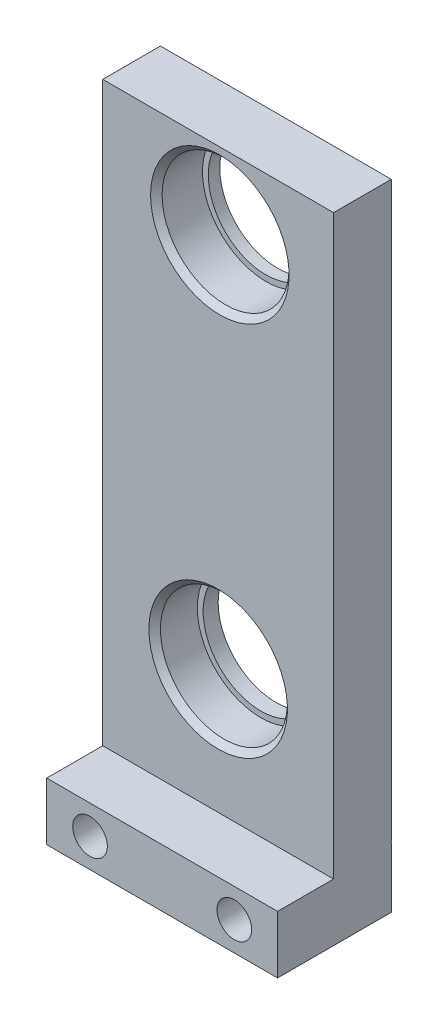
ISO-10303-21;
HEADER;
FILE_DESCRIPTION(('STEP AP214'),'2;1');
FILE_NAME('part.step','',(''),(''),'','','');
FILE_SCHEMA(('AUTOMOTIVE_DESIGN { 1 0 10303 214 1 1 1 1 }'));
ENDSEC;
DATA;
#1=APPLICATION_CONTEXT('core data for automotive mechanical design processes');
#2=APPLICATION_PROTOCOL_DEFINITION('international standard','automotive_design',2000,#1);
#3=PRODUCT_CONTEXT('',#1,'mechanical');
#4=PRODUCT('Part','Part','',(#3));
#5=PRODUCT_RELATED_PRODUCT_CATEGORY('part','',(#4));
#6=PRODUCT_DEFINITION_FORMATION('','',#4);
#7=PRODUCT_DEFINITION_CONTEXT('part definition',#1,'design');
#8=PRODUCT_DEFINITION('design','',#6,#7);
#9=PRODUCT_DEFINITION_SHAPE('','',#8);
#10=(LENGTH_UNIT() NAMED_UNIT(*) SI_UNIT(.MILLI.,.METRE.));
#11=(NAMED_UNIT(*) PLANE_ANGLE_UNIT() SI_UNIT($,.RADIAN.));
#12=(NAMED_UNIT(*) SI_UNIT($,.STERADIAN.) SOLID_ANGLE_UNIT());
#13=UNCERTAINTY_MEASURE_WITH_UNIT(LENGTH_MEASURE(1.E-05),#10,'distance_accuracy_value','');
#14=(GEOMETRIC_REPRESENTATION_CONTEXT(3) GLOBAL_UNCERTAINTY_ASSIGNED_CONTEXT((#13)) GLOBAL_UNIT_ASSIGNED_CONTEXT((#10,
#11,#12)) REPRESENTATION_CONTEXT('',''));
#15=CARTESIAN_POINT('',(0.,0.,0.));
#16=DIRECTION('',(0.,0.,1.));
#17=DIRECTION('',(1.,0.,0.));
#18=AXIS2_PLACEMENT_3D('',#15,#16,#17);
#19=CARTESIAN_POINT('',(7.5,5.,21.));
#20=DIRECTION('',(0.,0.,-1.));
#21=DIRECTION('',(-1.,0.,0.));
#22=AXIS2_PLACEMENT_3D('',#19,#20,#21);
#23=CYLINDRICAL_SURFACE('',#22,3.);
#24=CARTESIAN_POINT('',(7.5,5.,19.7));
#25=DIRECTION('',(0.,0.,-1.));
#26=DIRECTION('',(-1.,0.,0.));
#27=AXIS2_PLACEMENT_3D('',#24,#25,#26);
#28=CIRCLE('',#27,3.);
#29=CARTESIAN_POINT('',(4.5,5.,19.7));
#30=VERTEX_POINT('',#29);
#31=EDGE_CURVE('E271',#30,#30,#28,.T.);
#32=ORIENTED_EDGE('',*,*,#31,.F.);
#33=EDGE_LOOP('',(#32));
#34=FACE_BOUND('',#33,.T.);
#35=CARTESIAN_POINT('',(7.5,5.,13.));
#36=DIRECTION('',(0.,0.,-1.));
#37=DIRECTION('',(-1.,0.,0.));
#38=AXIS2_PLACEMENT_3D('',#35,#36,#37);
#39=CIRCLE('',#38,3.);
#40=CARTESIAN_POINT('',(4.5,5.,13.));
#41=VERTEX_POINT('',#40);
#42=EDGE_CURVE('E275',#41,#41,#39,.F.);
#43=ORIENTED_EDGE('',*,*,#42,.F.);
#44=EDGE_LOOP('',(#43));
#45=FACE_BOUND('',#44,.T.);
#46=ADVANCED_FACE('F53',(#34,#45),#23,.F.);
#47=CARTESIAN_POINT('',(32.5,5.,21.));
#48=DIRECTION('',(0.,0.,-1.));
#49=DIRECTION('',(-1.,0.,0.));
#50=AXIS2_PLACEMENT_3D('',#47,#48,#49);
#51=CYLINDRICAL_SURFACE('',#50,3.);
#52=CARTESIAN_POINT('',(32.5,5.,19.7));
#53=DIRECTION('',(0.,0.,-1.));
#54=DIRECTION('',(-1.,0.,0.));
#55=AXIS2_PLACEMENT_3D('',#52,#53,#54);
#56=CIRCLE('',#55,3.);
#57=CARTESIAN_POINT('',(29.5,5.,19.7));
#58=VERTEX_POINT('',#57);
#59=EDGE_CURVE('E166',#58,#58,#56,.T.);
#60=ORIENTED_EDGE('',*,*,#59,.F.);
#61=EDGE_LOOP('',(#60));
#62=FACE_BOUND('',#61,.T.);
#63=CARTESIAN_POINT('',(32.5,5.,13.));
#64=DIRECTION('',(0.,0.,-1.));
#65=DIRECTION('',(-1.,0.,0.));
#66=AXIS2_PLACEMENT_3D('',#63,#64,#65);
#67=CIRCLE('',#66,3.);
#68=CARTESIAN_POINT('',(29.5,5.,13.));
#69=VERTEX_POINT('',#68);
#70=EDGE_CURVE('E279',#69,#69,#67,.F.);
#71=ORIENTED_EDGE('',*,*,#70,.F.);
#72=EDGE_LOOP('',(#71));
#73=FACE_BOUND('',#72,.T.);
#74=ADVANCED_FACE('F361',(#62,#73),#51,.F.);
#75=CARTESIAN_POINT('',(0.,0.,10.));
#76=DIRECTION('',(0.,0.,-1.));
#77=DIRECTION('',(-1.,0.,0.));
#78=AXIS2_PLACEMENT_3D('',#75,#76,#77);
#79=PLANE('',#78);
#80=CARTESIAN_POINT('',(20.2904559974548,96.8,10.));
#81=DIRECTION('',(0.,0.,-1.));
#82=DIRECTION('',(-1.,0.,0.));
#83=AXIS2_PLACEMENT_3D('',#80,#81,#82);
#84=CIRCLE('',#83,12.);
#85=CARTESIAN_POINT('',(8.29045599745482,96.8,10.));
#86=VERTEX_POINT('',#85);
#87=EDGE_CURVE('E147',#86,#86,#84,.T.);
#88=ORIENTED_EDGE('',*,*,#87,.T.);
#89=EDGE_LOOP('',(#88));
#90=FACE_BOUND('',#89,.T.);
#91=CARTESIAN_POINT('',(20.,31.5,10.));
#92=DIRECTION('',(0.,0.,-1.));
#93=DIRECTION('',(-1.,0.,0.));
#94=AXIS2_PLACEMENT_3D('',#91,#92,#93);
#95=CIRCLE('',#94,12.);
#96=CARTESIAN_POINT('',(8.00000000000004,31.5,10.));
#97=VERTEX_POINT('',#96);
#98=EDGE_CURVE('E264',#97,#97,#95,.T.);
#99=ORIENTED_EDGE('',*,*,#98,.T.);
#100=EDGE_LOOP('',(#99));
#101=FACE_BOUND('',#100,.T.);
#102=DIRECTION('',(-1.,0.,0.));
#103=VECTOR('',#102,1.);
#104=CARTESIAN_POINT('',(0.,10.,10.));
#105=LINE('',#104,#103);
#106=CARTESIAN_POINT('',(40.,10.,10.));
#107=VERTEX_POINT('',#106);
#108=CARTESIAN_POINT('',(0.,10.,10.));
#109=VERTEX_POINT('',#108);
#110=EDGE_CURVE('E72',#107,#109,#105,.T.);
#111=ORIENTED_EDGE('',*,*,#110,.F.);
#112=DIRECTION('',(0.,1.,0.));
#113=VECTOR('',#112,1.);
#114=CARTESIAN_POINT('',(40.,0.,10.));
#115=LINE('',#114,#113);
#116=CARTESIAN_POINT('',(40.,110.,10.));
#117=VERTEX_POINT('',#116);
#118=EDGE_CURVE('E228',#107,#117,#115,.T.);
#119=ORIENTED_EDGE('',*,*,#118,.T.);
#120=DIRECTION('',(-1.,0.,0.));
#121=VECTOR('',#120,1.);
#122=CARTESIAN_POINT('',(0.,110.,10.));
#123=LINE('',#122,#121);
#124=CARTESIAN_POINT('',(0.,110.,10.));
#125=VERTEX_POINT('',#124);
#126=EDGE_CURVE('E232',#117,#125,#123,.T.);
#127=ORIENTED_EDGE('',*,*,#126,.T.);
#128=DIRECTION('',(0.,-1.,0.));
#129=VECTOR('',#128,1.);
#130=CARTESIAN_POINT('',(0.,0.,10.));
#131=LINE('',#130,#129);
#132=EDGE_CURVE('E225',#125,#109,#131,.T.);
#133=ORIENTED_EDGE('',*,*,#132,.T.);
#134=EDGE_LOOP('',(#111,#119,#127,#133));
#135=FACE_BOUND('',#134,.T.);
#136=ADVANCED_FACE('F334',(#90,#101,#135),#79,.F.);
#137=CARTESIAN_POINT('',(0.,0.,0.));
#138=DIRECTION('',(0.,0.,-1.));
#139=DIRECTION('',(-1.,0.,0.));
#140=AXIS2_PLACEMENT_3D('',#137,#138,#139);
#141=PLANE('',#140);
#142=CARTESIAN_POINT('',(20.,31.5,0.));
#143=DIRECTION('',(0.,0.,-1.));
#144=DIRECTION('',(-1.,0.,0.));
#145=AXIS2_PLACEMENT_3D('',#142,#143,#144);
#146=CIRCLE('',#145,10.);
#147=CARTESIAN_POINT('',(10.,31.5,0.));
#148=VERTEX_POINT('',#147);
#149=EDGE_CURVE('E289',#148,#148,#146,.F.);
#150=ORIENTED_EDGE('',*,*,#149,.T.);
#151=EDGE_LOOP('',(#150));
#152=FACE_BOUND('',#151,.T.);
#153=CARTESIAN_POINT('',(20.2904559974548,96.8,0.));
#154=DIRECTION('',(0.,0.,-1.));
#155=DIRECTION('',(-1.,0.,0.));
#156=AXIS2_PLACEMENT_3D('',#153,#154,#155);
#157=CIRCLE('',#156,10.);
#158=CARTESIAN_POINT('',(10.2904559974548,96.8,0.));
#159=VERTEX_POINT('',#158);
#160=EDGE_CURVE('E187',#159,#159,#157,.T.);
#161=ORIENTED_EDGE('',*,*,#160,.F.);
#162=EDGE_LOOP('',(#161));
#163=FACE_BOUND('',#162,.T.);
#164=DIRECTION('',(1.,0.,0.));
#165=VECTOR('',#164,1.);
#166=CARTESIAN_POINT('',(40.,10.6,0.));
#167=LINE('',#166,#165);
#168=CARTESIAN_POINT('',(0.,10.6,0.));
#169=VERTEX_POINT('',#168);
#170=CARTESIAN_POINT('',(40.,10.6,0.));
#171=VERTEX_POINT('',#170);
#172=EDGE_CURVE('E198',#169,#171,#167,.T.);
#173=ORIENTED_EDGE('',*,*,#172,.F.);
#174=DIRECTION('',(0.,-1.,0.));
#175=VECTOR('',#174,1.);
#176=CARTESIAN_POINT('',(0.,0.,0.));
#177=LINE('',#176,#175);
#178=CARTESIAN_POINT('',(0.,110.,0.));
#179=VERTEX_POINT('',#178);
#180=EDGE_CURVE('E236',#179,#169,#177,.T.);
#181=ORIENTED_EDGE('',*,*,#180,.F.);
#182=DIRECTION('',(-1.,0.,0.));
#183=VECTOR('',#182,1.);
#184=CARTESIAN_POINT('',(0.,110.,0.));
#185=LINE('',#184,#183);
#186=CARTESIAN_POINT('',(40.,110.,0.));
#187=VERTEX_POINT('',#186);
#188=EDGE_CURVE('E229',#187,#179,#185,.T.);
#189=ORIENTED_EDGE('',*,*,#188,.F.);
#190=DIRECTION('',(0.,1.,0.));
#191=VECTOR('',#190,1.);
#192=CARTESIAN_POINT('',(40.,0.,0.));
#193=LINE('',#192,#191);
#194=EDGE_CURVE('E242',#171,#187,#193,.T.);
#195=ORIENTED_EDGE('',*,*,#194,.F.);
#196=EDGE_LOOP('',(#173,#181,#189,#195));
#197=FACE_BOUND('',#196,.T.);
#198=ADVANCED_FACE('F322',(#152,#163,#197),#141,.T.);
#199=CARTESIAN_POINT('',(0.,0.,10.));
#200=DIRECTION('',(1.,0.,0.));
#201=DIRECTION('',(0.,0.,-1.));
#202=AXIS2_PLACEMENT_3D('',#199,#200,#201);
#203=PLANE('',#202);
#204=ORIENTED_EDGE('',*,*,#180,.T.);
#205=DIRECTION('',(0.,0.,-1.));
#206=VECTOR('',#205,1.);
#207=CARTESIAN_POINT('',(0.,10.6,0.1));
#208=LINE('',#207,#206);
#209=CARTESIAN_POINT('',(0.,10.6,0.1));
#210=VERTEX_POINT('',#209);
#211=EDGE_CURVE('E217',#210,#169,#208,.T.);
#212=ORIENTED_EDGE('',*,*,#211,.F.);
#213=DIRECTION('',(0.,1.,0.));
#214=VECTOR('',#213,1.);
#215=CARTESIAN_POINT('',(0.,10.5,0.1));
#216=LINE('',#215,#214);
#217=CARTESIAN_POINT('',(0.,10.5,0.1));
#218=VERTEX_POINT('',#217);
#219=EDGE_CURVE('E202',#218,#210,#216,.T.);
#220=ORIENTED_EDGE('',*,*,#219,.F.);
#221=DIRECTION('',(0.,0.,-1.));
#222=VECTOR('',#221,1.);
#223=CARTESIAN_POINT('',(0.,10.5,0.1));
#224=LINE('',#223,#222);
#225=CARTESIAN_POINT('',(0.,10.5,0.));
#226=VERTEX_POINT('',#225);
#227=EDGE_CURVE('E220',#218,#226,#224,.T.);
#228=ORIENTED_EDGE('',*,*,#227,.T.);
#229=CARTESIAN_POINT('',(0.,0.,0.));
#230=VERTEX_POINT('',#229);
#231=EDGE_CURVE('E143',#226,#230,#177,.T.);
#232=ORIENTED_EDGE('',*,*,#231,.T.);
#233=DIRECTION('',(0.,0.,-1.));
#234=VECTOR('',#233,1.);
#235=CARTESIAN_POINT('',(0.,0.,10.));
#236=LINE('',#235,#234);
#237=CARTESIAN_POINT('',(0.,0.,19.7));
#238=VERTEX_POINT('',#237);
#239=EDGE_CURVE('E134',#238,#230,#236,.T.);
#240=ORIENTED_EDGE('',*,*,#239,.F.);
#241=DIRECTION('',(0.,-1.,0.));
#242=VECTOR('',#241,1.);
#243=CARTESIAN_POINT('',(0.,0.,19.7));
#244=LINE('',#243,#242);
#245=CARTESIAN_POINT('',(0.,10.,19.7));
#246=VERTEX_POINT('',#245);
#247=EDGE_CURVE('E140',#246,#238,#244,.T.);
#248=ORIENTED_EDGE('',*,*,#247,.F.);
#249=DIRECTION('',(0.,0.,-1.));
#250=VECTOR('',#249,1.);
#251=CARTESIAN_POINT('',(0.,10.,19.7));
#252=LINE('',#251,#250);
#253=EDGE_CURVE('E175',#246,#109,#252,.T.);
#254=ORIENTED_EDGE('',*,*,#253,.T.);
#255=ORIENTED_EDGE('',*,*,#132,.F.);
#256=DIRECTION('',(0.,0.,-1.));
#257=VECTOR('',#256,1.);
#258=CARTESIAN_POINT('',(0.,110.,10.));
#259=LINE('',#258,#257);
#260=EDGE_CURVE('E235',#125,#179,#259,.T.);
#261=ORIENTED_EDGE('',*,*,#260,.T.);
#262=EDGE_LOOP('',(#204,#212,#220,#228,#232,#240,#248,#254,#255,#261));
#263=FACE_BOUND('',#262,.T.);
#264=ADVANCED_FACE('F137',(#263),#203,.F.);
#265=CARTESIAN_POINT('',(0.,0.,10.));
#266=DIRECTION('',(0.,1.,0.));
#267=DIRECTION('',(0.,0.,1.));
#268=AXIS2_PLACEMENT_3D('',#265,#266,#267);
#269=PLANE('',#268);
#270=DIRECTION('',(1.,0.,0.));
#271=VECTOR('',#270,1.);
#272=CARTESIAN_POINT('',(0.,0.,0.));
#273=LINE('',#272,#271);
#274=CARTESIAN_POINT('',(40.,0.,0.));
#275=VERTEX_POINT('',#274);
#276=EDGE_CURVE('E239',#230,#275,#273,.T.);
#277=ORIENTED_EDGE('',*,*,#276,.T.);
#278=DIRECTION('',(0.,0.,-1.));
#279=VECTOR('',#278,1.);
#280=CARTESIAN_POINT('',(40.,0.,10.));
#281=LINE('',#280,#279);
#282=CARTESIAN_POINT('',(40.,0.,19.7));
#283=VERTEX_POINT('',#282);
#284=EDGE_CURVE('E148',#283,#275,#281,.T.);
#285=ORIENTED_EDGE('',*,*,#284,.F.);
#286=DIRECTION('',(1.,0.,0.));
#287=VECTOR('',#286,1.);
#288=CARTESIAN_POINT('',(0.,0.,19.7));
#289=LINE('',#288,#287);
#290=EDGE_CURVE('E151',#238,#283,#289,.T.);
#291=ORIENTED_EDGE('',*,*,#290,.F.);
#292=ORIENTED_EDGE('',*,*,#239,.T.);
#293=EDGE_LOOP('',(#277,#285,#291,#292));
#294=FACE_BOUND('',#293,.T.);
#295=ADVANCED_FACE('F152',(#294),#269,.F.);
#296=CARTESIAN_POINT('',(40.,0.,10.));
#297=DIRECTION('',(-1.,0.,0.));
#298=DIRECTION('',(0.,0.,1.));
#299=AXIS2_PLACEMENT_3D('',#296,#297,#298);
#300=PLANE('',#299);
#301=DIRECTION('',(0.,-1.,0.));
#302=VECTOR('',#301,1.);
#303=CARTESIAN_POINT('',(40.,10.5,0.1));
#304=LINE('',#303,#302);
#305=CARTESIAN_POINT('',(40.,10.6,0.1));
#306=VERTEX_POINT('',#305);
#307=CARTESIAN_POINT('',(40.,10.5,0.1));
#308=VERTEX_POINT('',#307);
#309=EDGE_CURVE('E193',#306,#308,#304,.T.);
#310=ORIENTED_EDGE('',*,*,#309,.F.);
#311=DIRECTION('',(0.,0.,-1.));
#312=VECTOR('',#311,1.);
#313=CARTESIAN_POINT('',(40.,10.6,0.1));
#314=LINE('',#313,#312);
#315=EDGE_CURVE('E213',#306,#171,#314,.T.);
#316=ORIENTED_EDGE('',*,*,#315,.T.);
#317=ORIENTED_EDGE('',*,*,#194,.T.);
#318=DIRECTION('',(0.,0.,-1.));
#319=VECTOR('',#318,1.);
#320=CARTESIAN_POINT('',(40.,110.,10.));
#321=LINE('',#320,#319);
#322=EDGE_CURVE('E252',#117,#187,#321,.T.);
#323=ORIENTED_EDGE('',*,*,#322,.F.);
#324=ORIENTED_EDGE('',*,*,#118,.F.);
#325=DIRECTION('',(0.,0.,-1.));
#326=VECTOR('',#325,1.);
#327=CARTESIAN_POINT('',(40.,10.,19.7));
#328=LINE('',#327,#326);
#329=CARTESIAN_POINT('',(40.,10.,19.7));
#330=VERTEX_POINT('',#329);
#331=EDGE_CURVE('E179',#330,#107,#328,.T.);
#332=ORIENTED_EDGE('',*,*,#331,.F.);
#333=DIRECTION('',(0.,1.,0.));
#334=VECTOR('',#333,1.);
#335=CARTESIAN_POINT('',(40.,0.,19.7));
#336=LINE('',#335,#334);
#337=EDGE_CURVE('E157',#283,#330,#336,.T.);
#338=ORIENTED_EDGE('',*,*,#337,.F.);
#339=ORIENTED_EDGE('',*,*,#284,.T.);
#340=CARTESIAN_POINT('',(40.,10.5,0.));
#341=VERTEX_POINT('',#340);
#342=EDGE_CURVE('E243',#275,#341,#193,.T.);
#343=ORIENTED_EDGE('',*,*,#342,.T.);
#344=DIRECTION('',(0.,0.,-1.));
#345=VECTOR('',#344,1.);
#346=CARTESIAN_POINT('',(40.,10.5,0.1));
#347=LINE('',#346,#345);
#348=EDGE_CURVE('E80',#308,#341,#347,.T.);
#349=ORIENTED_EDGE('',*,*,#348,.F.);
#350=EDGE_LOOP('',(#310,#316,#317,#323,#324,#332,#338,#339,#343,#349));
#351=FACE_BOUND('',#350,.T.);
#352=ADVANCED_FACE('F326',(#351),#300,.F.);
#353=CARTESIAN_POINT('',(0.,110.,10.));
#354=DIRECTION('',(0.,-1.,0.));
#355=DIRECTION('',(0.,0.,-1.));
#356=AXIS2_PLACEMENT_3D('',#353,#354,#355);
#357=PLANE('',#356);
#358=ORIENTED_EDGE('',*,*,#188,.T.);
#359=ORIENTED_EDGE('',*,*,#260,.F.);
#360=ORIENTED_EDGE('',*,*,#126,.F.);
#361=ORIENTED_EDGE('',*,*,#322,.T.);
#362=EDGE_LOOP('',(#358,#359,#360,#361));
#363=FACE_BOUND('',#362,.T.);
#364=ADVANCED_FACE('F319',(#363),#357,.F.);
#365=CARTESIAN_POINT('',(32.5,5.,0.));
#366=DIRECTION('',(0.,0.,-1.));
#367=DIRECTION('',(-1.,0.,0.));
#368=AXIS2_PLACEMENT_3D('',#365,#366,#367);
#369=CIRCLE('',#368,4.5);
#370=CARTESIAN_POINT('',(28.,5.,0.));
#371=VERTEX_POINT('',#370);
#372=EDGE_CURVE('E306',#371,#371,#369,.T.);
#373=ORIENTED_EDGE('',*,*,#372,.F.);
#374=EDGE_LOOP('',(#373));
#375=FACE_BOUND('',#374,.T.);
#376=CARTESIAN_POINT('',(7.5,5.,0.));
#377=DIRECTION('',(0.,0.,-1.));
#378=DIRECTION('',(-1.,0.,0.));
#379=AXIS2_PLACEMENT_3D('',#376,#377,#378);
#380=CIRCLE('',#379,4.5);
#381=CARTESIAN_POINT('',(3.,5.,0.));
#382=VERTEX_POINT('',#381);
#383=EDGE_CURVE('E295',#382,#382,#380,.T.);
#384=ORIENTED_EDGE('',*,*,#383,.F.);
#385=EDGE_LOOP('',(#384));
#386=FACE_BOUND('',#385,.T.);
#387=DIRECTION('',(-1.,0.,0.));
#388=VECTOR('',#387,1.);
#389=CARTESIAN_POINT('',(40.,10.5,0.));
#390=LINE('',#389,#388);
#391=EDGE_CURVE('E192',#341,#226,#390,.T.);
#392=ORIENTED_EDGE('',*,*,#391,.F.);
#393=ORIENTED_EDGE('',*,*,#342,.F.);
#394=ORIENTED_EDGE('',*,*,#276,.F.);
#395=ORIENTED_EDGE('',*,*,#231,.F.);
#396=EDGE_LOOP('',(#392,#393,#394,#395));
#397=FACE_BOUND('',#396,.T.);
#398=ADVANCED_FACE('F315',(#375,#386,#397),#141,.T.);
#399=CARTESIAN_POINT('',(40.,10.6,0.1));
#400=DIRECTION('',(0.,1.,0.));
#401=DIRECTION('',(0.,0.,1.));
#402=AXIS2_PLACEMENT_3D('',#399,#400,#401);
#403=PLANE('',#402);
#404=ORIENTED_EDGE('',*,*,#172,.T.);
#405=ORIENTED_EDGE('',*,*,#315,.F.);
#406=DIRECTION('',(1.,0.,0.));
#407=VECTOR('',#406,1.);
#408=CARTESIAN_POINT('',(40.,10.6,0.1));
#409=LINE('',#408,#407);
#410=EDGE_CURVE('E205',#210,#306,#409,.T.);
#411=ORIENTED_EDGE('',*,*,#410,.F.);
#412=ORIENTED_EDGE('',*,*,#211,.T.);
#413=EDGE_LOOP('',(#404,#405,#411,#412));
#414=FACE_BOUND('',#413,.T.);
#415=ADVANCED_FACE('F318',(#414),#403,.F.);
#416=CARTESIAN_POINT('',(40.,10.5,0.1));
#417=DIRECTION('',(0.,-1.,0.));
#418=DIRECTION('',(0.,0.,-1.));
#419=AXIS2_PLACEMENT_3D('',#416,#417,#418);
#420=PLANE('',#419);
#421=ORIENTED_EDGE('',*,*,#391,.T.);
#422=ORIENTED_EDGE('',*,*,#227,.F.);
#423=DIRECTION('',(-1.,0.,0.));
#424=VECTOR('',#423,1.);
#425=CARTESIAN_POINT('',(40.,10.5,0.1));
#426=LINE('',#425,#424);
#427=EDGE_CURVE('E197',#308,#218,#426,.T.);
#428=ORIENTED_EDGE('',*,*,#427,.F.);
#429=ORIENTED_EDGE('',*,*,#348,.T.);
#430=EDGE_LOOP('',(#421,#422,#428,#429));
#431=FACE_BOUND('',#430,.T.);
#432=ADVANCED_FACE('F349',(#431),#420,.F.);
#433=CARTESIAN_POINT('',(0.,0.,0.1));
#434=DIRECTION('',(0.,0.,1.));
#435=DIRECTION('',(1.,0.,0.));
#436=AXIS2_PLACEMENT_3D('',#433,#434,#435);
#437=PLANE('',#436);
#438=ORIENTED_EDGE('',*,*,#309,.T.);
#439=ORIENTED_EDGE('',*,*,#427,.T.);
#440=ORIENTED_EDGE('',*,*,#219,.T.);
#441=ORIENTED_EDGE('',*,*,#410,.T.);
#442=EDGE_LOOP('',(#438,#439,#440,#441));
#443=FACE_BOUND('',#442,.T.);
#444=ADVANCED_FACE('F346',(#443),#437,.F.);
#445=CARTESIAN_POINT('',(20.,31.5,11.1));
#446=DIRECTION('',(0.,0.,-1.));
#447=DIRECTION('',(-1.,0.,0.));
#448=AXIS2_PLACEMENT_3D('',#445,#446,#447);
#449=CYLINDRICAL_SURFACE('',#448,11.);
#450=CARTESIAN_POINT('',(20.,31.5,2.6));
#451=DIRECTION('',(0.,0.,1.));
#452=DIRECTION('',(1.,0.,0.));
#453=AXIS2_PLACEMENT_3D('',#450,#451,#452);
#454=CIRCLE('',#453,11.);
#455=CARTESIAN_POINT('',(31.,31.5,2.6));
#456=VERTEX_POINT('',#455);
#457=EDGE_CURVE('E286',#456,#456,#454,.F.);
#458=ORIENTED_EDGE('',*,*,#457,.T.);
#459=EDGE_LOOP('',(#458));
#460=FACE_BOUND('',#459,.T.);
#461=CARTESIAN_POINT('',(20.,31.5,9.00000000000004));
#462=DIRECTION('',(0.,0.,-1.));
#463=DIRECTION('',(-1.,0.,0.));
#464=AXIS2_PLACEMENT_3D('',#461,#462,#463);
#465=CIRCLE('',#464,11.);
#466=CARTESIAN_POINT('',(9.,31.5,9.00000000000004));
#467=VERTEX_POINT('',#466);
#468=EDGE_CURVE('E64',#467,#467,#465,.F.);
#469=ORIENTED_EDGE('',*,*,#468,.T.);
#470=EDGE_LOOP('',(#469));
#471=FACE_BOUND('',#470,.T.);
#472=ADVANCED_FACE('F356',(#460,#471),#449,.F.);
#473=CARTESIAN_POINT('',(20.2904559974548,96.8,2.));
#474=DIRECTION('',(0.,0.,1.));
#475=DIRECTION('',(1.,0.,0.));
#476=AXIS2_PLACEMENT_3D('',#473,#474,#475);
#477=CYLINDRICAL_SURFACE('',#476,11.);
#478=CARTESIAN_POINT('',(20.2904559974548,96.8,8.99999999999999));
#479=DIRECTION('',(0.,0.,-1.));
#480=DIRECTION('',(-1.,0.,0.));
#481=AXIS2_PLACEMENT_3D('',#478,#479,#480);
#482=CIRCLE('',#481,11.);
#483=CARTESIAN_POINT('',(9.29045599745483,96.8,8.99999999999999));
#484=VERTEX_POINT('',#483);
#485=EDGE_CURVE('E12',#484,#484,#482,.F.);
#486=ORIENTED_EDGE('',*,*,#485,.T.);
#487=EDGE_LOOP('',(#486));
#488=FACE_BOUND('',#487,.T.);
#489=CARTESIAN_POINT('',(20.2904559974548,96.8,2.));
#490=DIRECTION('',(0.,0.,1.));
#491=DIRECTION('',(1.,0.,0.));
#492=AXIS2_PLACEMENT_3D('',#489,#490,#491);
#493=CIRCLE('',#492,11.);
#494=CARTESIAN_POINT('',(31.2904559974548,96.8,2.));
#495=VERTEX_POINT('',#494);
#496=EDGE_CURVE('E188',#495,#495,#493,.T.);
#497=ORIENTED_EDGE('',*,*,#496,.F.);
#498=EDGE_LOOP('',(#497));
#499=FACE_BOUND('',#498,.T.);
#500=ADVANCED_FACE('F387',(#488,#499),#477,.F.);
#501=CARTESIAN_POINT('',(20.2904559974548,96.8,2.));
#502=DIRECTION('',(0.,0.,1.));
#503=DIRECTION('',(1.,0.,0.));
#504=AXIS2_PLACEMENT_3D('',#501,#502,#503);
#505=PLANE('',#504);
#506=CARTESIAN_POINT('',(20.2904559974548,96.8,2.));
#507=DIRECTION('',(0.,0.,1.));
#508=DIRECTION('',(1.,0.,0.));
#509=AXIS2_PLACEMENT_3D('',#506,#507,#508);
#510=CIRCLE('',#509,10.);
#511=CARTESIAN_POINT('',(30.2904559974548,96.8,2.));
#512=VERTEX_POINT('',#511);
#513=EDGE_CURVE('E183',#512,#512,#510,.T.);
#514=ORIENTED_EDGE('',*,*,#513,.F.);
#515=EDGE_LOOP('',(#514));
#516=FACE_BOUND('',#515,.T.);
#517=ORIENTED_EDGE('',*,*,#496,.T.);
#518=EDGE_LOOP('',(#517));
#519=FACE_BOUND('',#518,.T.);
#520=ADVANCED_FACE('F383',(#516,#519),#505,.T.);
#521=CARTESIAN_POINT('',(20.2904559974548,96.8,-6.));
#522=DIRECTION('',(0.,0.,1.));
#523=DIRECTION('',(1.,0.,0.));
#524=AXIS2_PLACEMENT_3D('',#521,#522,#523);
#525=CYLINDRICAL_SURFACE('',#524,10.);
#526=ORIENTED_EDGE('',*,*,#160,.T.);
#527=EDGE_LOOP('',(#526));
#528=FACE_BOUND('',#527,.T.);
#529=ORIENTED_EDGE('',*,*,#513,.T.);
#530=EDGE_LOOP('',(#529));
#531=FACE_BOUND('',#530,.T.);
#532=ADVANCED_FACE('F379',(#528,#531),#525,.F.);
#533=CARTESIAN_POINT('',(20.,31.5,10.));
#534=DIRECTION('',(0.,0.,1.));
#535=DIRECTION('',(1.,0.,0.));
#536=AXIS2_PLACEMENT_3D('',#533,#534,#535);
#537=CONICAL_SURFACE('',#536,12.,0.785398163397448);
#538=ORIENTED_EDGE('',*,*,#468,.F.);
#539=EDGE_LOOP('',(#538));
#540=FACE_BOUND('',#539,.T.);
#541=ORIENTED_EDGE('',*,*,#98,.F.);
#542=EDGE_LOOP('',(#541));
#543=FACE_BOUND('',#542,.T.);
#544=ADVANCED_FACE('F382',(#540,#543),#537,.F.);
#545=CARTESIAN_POINT('',(20.2904559974548,96.8,8.99999999999999));
#546=DIRECTION('',(0.,0.,1.));
#547=DIRECTION('',(1.,0.,0.));
#548=AXIS2_PLACEMENT_3D('',#545,#546,#547);
#549=CONICAL_SURFACE('',#548,11.,0.78539816339745);
#550=ORIENTED_EDGE('',*,*,#87,.F.);
#551=EDGE_LOOP('',(#550));
#552=FACE_BOUND('',#551,.T.);
#553=ORIENTED_EDGE('',*,*,#485,.F.);
#554=EDGE_LOOP('',(#553));
#555=FACE_BOUND('',#554,.T.);
#556=ADVANCED_FACE('F56',(#552,#555),#549,.F.);
#557=CARTESIAN_POINT('',(0.,10.,19.7));
#558=DIRECTION('',(0.,-1.,0.));
#559=DIRECTION('',(0.,0.,-1.));
#560=AXIS2_PLACEMENT_3D('',#557,#558,#559);
#561=PLANE('',#560);
#562=ORIENTED_EDGE('',*,*,#110,.T.);
#563=ORIENTED_EDGE('',*,*,#253,.F.);
#564=DIRECTION('',(-1.,0.,0.));
#565=VECTOR('',#564,1.);
#566=CARTESIAN_POINT('',(0.,10.,19.7));
#567=LINE('',#566,#565);
#568=EDGE_CURVE('E161',#330,#246,#567,.T.);
#569=ORIENTED_EDGE('',*,*,#568,.F.);
#570=ORIENTED_EDGE('',*,*,#331,.T.);
#571=EDGE_LOOP('',(#562,#563,#569,#570));
#572=FACE_BOUND('',#571,.T.);
#573=ADVANCED_FACE('F330',(#572),#561,.F.);
#574=CARTESIAN_POINT('',(0.,0.,19.7));
#575=DIRECTION('',(0.,0.,-1.));
#576=DIRECTION('',(-1.,0.,0.));
#577=AXIS2_PLACEMENT_3D('',#574,#575,#576);
#578=PLANE('',#577);
#579=ORIENTED_EDGE('',*,*,#59,.T.);
#580=EDGE_LOOP('',(#579));
#581=FACE_BOUND('',#580,.T.);
#582=ORIENTED_EDGE('',*,*,#31,.T.);
#583=EDGE_LOOP('',(#582));
#584=FACE_BOUND('',#583,.T.);
#585=ORIENTED_EDGE('',*,*,#247,.T.);
#586=ORIENTED_EDGE('',*,*,#290,.T.);
#587=ORIENTED_EDGE('',*,*,#337,.T.);
#588=ORIENTED_EDGE('',*,*,#568,.T.);
#589=EDGE_LOOP('',(#585,#586,#587,#588));
#590=FACE_BOUND('',#589,.T.);
#591=ADVANCED_FACE('F159',(#581,#584,#590),#578,.F.);
#592=CARTESIAN_POINT('',(32.5,5.,13.));
#593=DIRECTION('',(0.,0.,-1.));
#594=DIRECTION('',(-1.,0.,0.));
#595=AXIS2_PLACEMENT_3D('',#592,#593,#594);
#596=PLANE('',#595);
#597=CARTESIAN_POINT('',(32.5,5.,13.));
#598=DIRECTION('',(0.,0.,-1.));
#599=DIRECTION('',(-1.,0.,0.));
#600=AXIS2_PLACEMENT_3D('',#597,#598,#599);
#601=CIRCLE('',#600,4.5);
#602=CARTESIAN_POINT('',(28.,5.,13.));
#603=VERTEX_POINT('',#602);
#604=EDGE_CURVE('E283',#603,#603,#601,.T.);
#605=ORIENTED_EDGE('',*,*,#604,.T.);
#606=EDGE_LOOP('',(#605));
#607=FACE_BOUND('',#606,.T.);
#608=ORIENTED_EDGE('',*,*,#70,.T.);
#609=EDGE_LOOP('',(#608));
#610=FACE_BOUND('',#609,.T.);
#611=ADVANCED_FACE('F375',(#607,#610),#596,.T.);
#612=CARTESIAN_POINT('',(32.5,5.,13.));
#613=DIRECTION('',(0.,0.,-1.));
#614=DIRECTION('',(-1.,0.,0.));
#615=AXIS2_PLACEMENT_3D('',#612,#613,#614);
#616=CYLINDRICAL_SURFACE('',#615,4.5);
#617=CARTESIAN_POINT('',(28.,5.,13.));
#618=CARTESIAN_POINT('',(28.,5.,12.8645833333333));
#619=CARTESIAN_POINT('',(28.,5.,12.7291666666667));
#620=CARTESIAN_POINT('',(28.,5.,12.4583333333333));
#621=CARTESIAN_POINT('',(28.,5.,12.3229166666667));
#622=CARTESIAN_POINT('',(28.,5.,12.0520833333333));
#623=CARTESIAN_POINT('',(28.,5.,11.9166666666667));
#624=CARTESIAN_POINT('',(28.,5.,11.6458333333333));
#625=CARTESIAN_POINT('',(28.,5.,11.5104166666667));
#626=CARTESIAN_POINT('',(28.,5.,11.2395833333333));
#627=CARTESIAN_POINT('',(28.,5.,11.1041666666667));
#628=CARTESIAN_POINT('',(28.,5.,10.8333333333333));
#629=CARTESIAN_POINT('',(28.,5.,10.6979166666667));
#630=CARTESIAN_POINT('',(28.,5.,10.4270833333333));
#631=CARTESIAN_POINT('',(28.,5.,10.2916666666667));
#632=CARTESIAN_POINT('',(28.,5.,10.0208333333333));
#633=CARTESIAN_POINT('',(28.,5.,9.88541666666667));
#634=CARTESIAN_POINT('',(28.,5.,9.61458333333333));
#635=CARTESIAN_POINT('',(28.,5.,9.47916666666667));
#636=CARTESIAN_POINT('',(28.,5.,9.20833333333333));
#637=CARTESIAN_POINT('',(28.,5.,9.07291666666667));
#638=CARTESIAN_POINT('',(28.,5.,8.80208333333333));
#639=CARTESIAN_POINT('',(28.,5.,8.66666666666667));
#640=CARTESIAN_POINT('',(28.,5.,8.39583333333333));
#641=CARTESIAN_POINT('',(28.,5.,8.26041666666667));
#642=CARTESIAN_POINT('',(28.,5.,7.98958333333333));
#643=CARTESIAN_POINT('',(28.,5.,7.85416666666667));
#644=CARTESIAN_POINT('',(28.,5.,7.58333333333333));
#645=CARTESIAN_POINT('',(28.,5.,7.44791666666667));
#646=CARTESIAN_POINT('',(28.,5.,7.17708333333333));
#647=CARTESIAN_POINT('',(28.,5.,7.04166666666667));
#648=CARTESIAN_POINT('',(28.,5.,6.77083333333333));
#649=CARTESIAN_POINT('',(28.,5.,6.63541666666667));
#650=CARTESIAN_POINT('',(28.,5.,6.36458333333333));
#651=CARTESIAN_POINT('',(28.,5.,6.22916666666667));
#652=CARTESIAN_POINT('',(28.,5.,5.95833333333333));
#653=CARTESIAN_POINT('',(28.,5.,5.82291666666667));
#654=CARTESIAN_POINT('',(28.,5.,5.55208333333333));
#655=CARTESIAN_POINT('',(28.,5.,5.41666666666667));
#656=CARTESIAN_POINT('',(28.,5.,5.14583333333333));
#657=CARTESIAN_POINT('',(28.,5.,5.01041666666667));
#658=CARTESIAN_POINT('',(28.,5.,4.73958333333333));
#659=CARTESIAN_POINT('',(28.,5.,4.60416666666667));
#660=CARTESIAN_POINT('',(28.,5.,4.33333333333333));
#661=CARTESIAN_POINT('',(28.,5.,4.19791666666667));
#662=CARTESIAN_POINT('',(28.,5.,3.92708333333333));
#663=CARTESIAN_POINT('',(28.,5.,3.79166666666667));
#664=CARTESIAN_POINT('',(28.,5.,3.52083333333333));
#665=CARTESIAN_POINT('',(28.,5.,3.38541666666667));
#666=CARTESIAN_POINT('',(28.,5.,3.11458333333333));
#667=CARTESIAN_POINT('',(28.,5.,2.97916666666667));
#668=CARTESIAN_POINT('',(28.,5.,2.70833333333333));
#669=CARTESIAN_POINT('',(28.,5.,2.57291666666667));
#670=CARTESIAN_POINT('',(28.,5.,2.30208333333333));
#671=CARTESIAN_POINT('',(28.,5.,2.16666666666667));
#672=CARTESIAN_POINT('',(28.,5.,1.89583333333333));
#673=CARTESIAN_POINT('',(28.,5.,1.76041666666667));
#674=CARTESIAN_POINT('',(28.,5.,1.48958333333333));
#675=CARTESIAN_POINT('',(28.,5.,1.35416666666667));
#676=CARTESIAN_POINT('',(28.,5.,1.08333333333333));
#677=CARTESIAN_POINT('',(28.,5.,0.947916666666667));
#678=CARTESIAN_POINT('',(28.,5.,0.677083333333334));
#679=CARTESIAN_POINT('',(28.,5.,0.541666666666667));
#680=CARTESIAN_POINT('',(28.,5.,0.270833333333334));
#681=CARTESIAN_POINT('',(28.,5.,0.135416666666667));
#682=CARTESIAN_POINT('',(28.,5.,0.));
#683=B_SPLINE_CURVE_WITH_KNOTS('',3,(#617,#618,#619,#620,#621,#622,#623,#624,#625,#626,#627,
#628,#629,#630,#631,#632,#633,#634,#635,#636,#637,#638,#639,#640,#641,#642,#643,#644,#645,#646,
#647,#648,#649,#650,#651,#652,#653,#654,#655,#656,#657,#658,#659,#660,#661,#662,#663,#664,#665,
#666,#667,#668,#669,#670,#671,#672,#673,#674,#675,#676,#677,#678,#679,#680,#681,#682),
.UNSPECIFIED.,.F.,.F.,(4,2,2,2,2,2,2,2,2,2,2,2,2,2,2,2,2,2,2,2,2,2,2,2,2,2,2,2,2,2,2,2,4),(0.,
0.406249999999999,0.812499999999999,1.21875,1.625,2.03125,2.4375,2.84375,3.25,3.65625,4.0625,
4.46875,4.875,5.28125,5.6875,6.09375,6.5,6.90625,7.3125,7.71875,8.125,8.53125,8.9375,9.34375,
9.75,10.15625,10.5625,10.96875,11.375,11.78125,12.1875,12.59375,13.),.UNSPECIFIED.);
#684=EDGE_CURVE('BSEAM538',#603,#371,#683,.T.);
#685=ORIENTED_EDGE('',*,*,#604,.F.);
#686=ORIENTED_EDGE('',*,*,#372,.T.);
#687=ORIENTED_EDGE('',*,*,#684,.T.);
#688=ORIENTED_EDGE('',*,*,#684,.F.);
#689=EDGE_LOOP('',(#685,#687,#686,#688));
#690=FACE_BOUND('',#689,.T.);
#691=ADVANCED_FACE('F538',(#690),#616,.F.);
#692=CARTESIAN_POINT('',(7.5,5.,13.));
#693=DIRECTION('',(0.,0.,-1.));
#694=DIRECTION('',(-1.,0.,0.));
#695=AXIS2_PLACEMENT_3D('',#692,#693,#694);
#696=PLANE('',#695);
#697=CARTESIAN_POINT('',(7.5,5.,13.));
#698=DIRECTION('',(0.,0.,-1.));
#699=DIRECTION('',(-1.,0.,0.));
#700=AXIS2_PLACEMENT_3D('',#697,#698,#699);
#701=CIRCLE('',#700,4.5);
#702=CARTESIAN_POINT('',(3.,5.,13.));
#703=VERTEX_POINT('',#702);
#704=EDGE_CURVE('E169',#703,#703,#701,.T.);
#705=ORIENTED_EDGE('',*,*,#704,.T.);
#706=EDGE_LOOP('',(#705));
#707=FACE_BOUND('',#706,.T.);
#708=ORIENTED_EDGE('',*,*,#42,.T.);
#709=EDGE_LOOP('',(#708));
#710=FACE_BOUND('',#709,.T.);
#711=ADVANCED_FACE('F547',(#707,#710),#696,.T.);
#712=CARTESIAN_POINT('',(7.5,5.,13.));
#713=DIRECTION('',(0.,0.,-1.));
#714=DIRECTION('',(-1.,0.,0.));
#715=AXIS2_PLACEMENT_3D('',#712,#713,#714);
#716=CYLINDRICAL_SURFACE('',#715,4.5);
#717=CARTESIAN_POINT('',(3.,5.,13.));
#718=CARTESIAN_POINT('',(3.,5.,12.8645833333333));
#719=CARTESIAN_POINT('',(3.,5.,12.7291666666667));
#720=CARTESIAN_POINT('',(3.,5.,12.4583333333333));
#721=CARTESIAN_POINT('',(3.,5.,12.3229166666667));
#722=CARTESIAN_POINT('',(3.,5.,12.0520833333333));
#723=CARTESIAN_POINT('',(3.,5.,11.9166666666667));
#724=CARTESIAN_POINT('',(3.,5.,11.6458333333333));
#725=CARTESIAN_POINT('',(3.,5.,11.5104166666667));
#726=CARTESIAN_POINT('',(3.,5.,11.2395833333333));
#727=CARTESIAN_POINT('',(3.,5.,11.1041666666667));
#728=CARTESIAN_POINT('',(3.,5.,10.8333333333333));
#729=CARTESIAN_POINT('',(3.,5.,10.6979166666667));
#730=CARTESIAN_POINT('',(3.,5.,10.4270833333333));
#731=CARTESIAN_POINT('',(3.,5.,10.2916666666667));
#732=CARTESIAN_POINT('',(3.,5.,10.0208333333333));
#733=CARTESIAN_POINT('',(3.,5.,9.88541666666667));
#734=CARTESIAN_POINT('',(3.,5.,9.61458333333333));
#735=CARTESIAN_POINT('',(3.,5.,9.47916666666667));
#736=CARTESIAN_POINT('',(3.,5.,9.20833333333333));
#737=CARTESIAN_POINT('',(3.,5.,9.07291666666667));
#738=CARTESIAN_POINT('',(3.,5.,8.80208333333333));
#739=CARTESIAN_POINT('',(3.,5.,8.66666666666667));
#740=CARTESIAN_POINT('',(3.,5.,8.39583333333333));
#741=CARTESIAN_POINT('',(3.,5.,8.26041666666667));
#742=CARTESIAN_POINT('',(3.,5.,7.98958333333333));
#743=CARTESIAN_POINT('',(3.,5.,7.85416666666667));
#744=CARTESIAN_POINT('',(3.,5.,7.58333333333333));
#745=CARTESIAN_POINT('',(3.,5.,7.44791666666667));
#746=CARTESIAN_POINT('',(3.,5.,7.17708333333333));
#747=CARTESIAN_POINT('',(3.,5.,7.04166666666667));
#748=CARTESIAN_POINT('',(3.,5.,6.77083333333333));
#749=CARTESIAN_POINT('',(3.,5.,6.63541666666667));
#750=CARTESIAN_POINT('',(3.,5.,6.36458333333333));
#751=CARTESIAN_POINT('',(3.,5.,6.22916666666667));
#752=CARTESIAN_POINT('',(3.,5.,5.95833333333333));
#753=CARTESIAN_POINT('',(3.,5.,5.82291666666667));
#754=CARTESIAN_POINT('',(3.,5.,5.55208333333333));
#755=CARTESIAN_POINT('',(3.,5.,5.41666666666667));
#756=CARTESIAN_POINT('',(3.,5.,5.14583333333333));
#757=CARTESIAN_POINT('',(3.,5.,5.01041666666667));
#758=CARTESIAN_POINT('',(3.,5.,4.73958333333333));
#759=CARTESIAN_POINT('',(3.,5.,4.60416666666667));
#760=CARTESIAN_POINT('',(3.,5.,4.33333333333333));
#761=CARTESIAN_POINT('',(3.,5.,4.19791666666667));
#762=CARTESIAN_POINT('',(3.,5.,3.92708333333333));
#763=CARTESIAN_POINT('',(3.,5.,3.79166666666667));
#764=CARTESIAN_POINT('',(3.,5.,3.52083333333333));
#765=CARTESIAN_POINT('',(3.,5.,3.38541666666667));
#766=CARTESIAN_POINT('',(3.,5.,3.11458333333333));
#767=CARTESIAN_POINT('',(3.,5.,2.97916666666667));
#768=CARTESIAN_POINT('',(3.,5.,2.70833333333333));
#769=CARTESIAN_POINT('',(3.,5.,2.57291666666667));
#770=CARTESIAN_POINT('',(3.,5.,2.30208333333333));
#771=CARTESIAN_POINT('',(3.,5.,2.16666666666667));
#772=CARTESIAN_POINT('',(3.,5.,1.89583333333333));
#773=CARTESIAN_POINT('',(3.,5.,1.76041666666667));
#774=CARTESIAN_POINT('',(3.,5.,1.48958333333333));
#775=CARTESIAN_POINT('',(3.,5.,1.35416666666667));
#776=CARTESIAN_POINT('',(3.,5.,1.08333333333333));
#777=CARTESIAN_POINT('',(3.,5.,0.947916666666667));
#778=CARTESIAN_POINT('',(3.,5.,0.677083333333334));
#779=CARTESIAN_POINT('',(3.,5.,0.541666666666667));
#780=CARTESIAN_POINT('',(3.,5.,0.270833333333334));
#781=CARTESIAN_POINT('',(3.,5.,0.135416666666667));
#782=CARTESIAN_POINT('',(3.,5.,0.));
#783=B_SPLINE_CURVE_WITH_KNOTS('',3,(#717,#718,#719,#720,#721,#722,#723,#724,#725,#726,#727,
#728,#729,#730,#731,#732,#733,#734,#735,#736,#737,#738,#739,#740,#741,#742,#743,#744,#745,#746,
#747,#748,#749,#750,#751,#752,#753,#754,#755,#756,#757,#758,#759,#760,#761,#762,#763,#764,#765,
#766,#767,#768,#769,#770,#771,#772,#773,#774,#775,#776,#777,#778,#779,#780,#781,#782),
.UNSPECIFIED.,.F.,.F.,(4,2,2,2,2,2,2,2,2,2,2,2,2,2,2,2,2,2,2,2,2,2,2,2,2,2,2,2,2,2,2,2,4),(0.,
0.406249999999999,0.812499999999999,1.21875,1.625,2.03125,2.4375,2.84375,3.25,3.65625,4.0625,
4.46875,4.875,5.28125,5.6875,6.09375,6.5,6.90625,7.3125,7.71875,8.125,8.53125,8.9375,9.34375,
9.75,10.15625,10.5625,10.96875,11.375,11.78125,12.1875,12.59375,13.),.UNSPECIFIED.);
#784=EDGE_CURVE('BSEAM313',#703,#382,#783,.T.);
#785=ORIENTED_EDGE('',*,*,#704,.F.);
#786=ORIENTED_EDGE('',*,*,#383,.T.);
#787=ORIENTED_EDGE('',*,*,#784,.T.);
#788=ORIENTED_EDGE('',*,*,#784,.F.);
#789=EDGE_LOOP('',(#785,#787,#786,#788));
#790=FACE_BOUND('',#789,.T.);
#791=ADVANCED_FACE('F313',(#790),#716,.F.);
#792=CARTESIAN_POINT('',(20.,31.5,2.6));
#793=DIRECTION('',(0.,0.,1.));
#794=DIRECTION('',(1.,0.,0.));
#795=AXIS2_PLACEMENT_3D('',#792,#793,#794);
#796=PLANE('',#795);
#797=CARTESIAN_POINT('',(20.,31.5,2.6));
#798=DIRECTION('',(0.,0.,1.));
#799=DIRECTION('',(1.,0.,0.));
#800=AXIS2_PLACEMENT_3D('',#797,#798,#799);
#801=CIRCLE('',#800,10.);
#802=CARTESIAN_POINT('',(30.,31.5,2.6));
#803=VERTEX_POINT('',#802);
#804=EDGE_CURVE('E58',#803,#803,#801,.F.);
#805=ORIENTED_EDGE('',*,*,#804,.T.);
#806=EDGE_LOOP('',(#805));
#807=FACE_BOUND('',#806,.T.);
#808=ORIENTED_EDGE('',*,*,#457,.F.);
#809=EDGE_LOOP('',(#808));
#810=FACE_BOUND('',#809,.T.);
#811=ADVANCED_FACE('F565',(#807,#810),#796,.T.);
#812=CARTESIAN_POINT('',(20.,31.5,-2.9));
#813=DIRECTION('',(0.,0.,1.));
#814=DIRECTION('',(1.,0.,0.));
#815=AXIS2_PLACEMENT_3D('',#812,#813,#814);
#816=CYLINDRICAL_SURFACE('',#815,10.);
#817=ORIENTED_EDGE('',*,*,#149,.F.);
#818=EDGE_LOOP('',(#817));
#819=FACE_BOUND('',#818,.T.);
#820=ORIENTED_EDGE('',*,*,#804,.F.);
#821=EDGE_LOOP('',(#820));
#822=FACE_BOUND('',#821,.T.);
#823=ADVANCED_FACE('F575',(#819,#822),#816,.F.);
#824=CLOSED_SHELL('',(#46,#74,#136,#198,#264,#295,#352,#364,#398,#415,#432,#444,#472,#500,#520,
#532,#544,#556,#573,#591,#611,#691,#711,#791,#811,#823));
#825=MANIFOLD_SOLID_BREP('B2',#824);
#826=ADVANCED_BREP_SHAPE_REPRESENTATION('',(#18,#825),#14);
#827=SHAPE_DEFINITION_REPRESENTATION(#9,#826);
ENDSEC;
END-ISO-10303-21;
